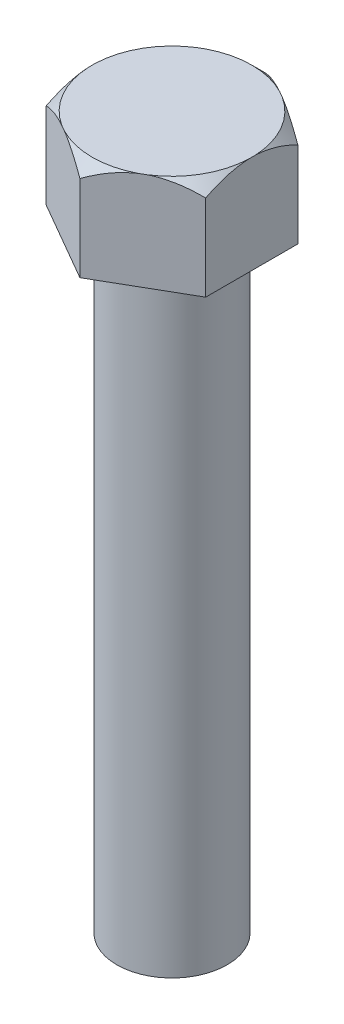
ISO-10303-21;
HEADER;
FILE_DESCRIPTION(('STEP AP214'),'2;1');
FILE_NAME('part.step','',(''),(''),'','','');
FILE_SCHEMA(('AUTOMOTIVE_DESIGN { 1 0 10303 214 1 1 1 1 }'));
ENDSEC;
DATA;
#1=APPLICATION_CONTEXT('core data for automotive mechanical design processes');
#2=APPLICATION_PROTOCOL_DEFINITION('international standard','automotive_design',2000,#1);
#3=PRODUCT_CONTEXT('',#1,'mechanical');
#4=PRODUCT('Part','Part','',(#3));
#5=PRODUCT_RELATED_PRODUCT_CATEGORY('part','',(#4));
#6=PRODUCT_DEFINITION_FORMATION('','',#4);
#7=PRODUCT_DEFINITION_CONTEXT('part definition',#1,'design');
#8=PRODUCT_DEFINITION('design','',#6,#7);
#9=PRODUCT_DEFINITION_SHAPE('','',#8);
#10=(LENGTH_UNIT() NAMED_UNIT(*) SI_UNIT(.MILLI.,.METRE.));
#11=(NAMED_UNIT(*) PLANE_ANGLE_UNIT() SI_UNIT($,.RADIAN.));
#12=(NAMED_UNIT(*) SI_UNIT($,.STERADIAN.) SOLID_ANGLE_UNIT());
#13=UNCERTAINTY_MEASURE_WITH_UNIT(LENGTH_MEASURE(1.E-05),#10,'distance_accuracy_value','');
#14=(GEOMETRIC_REPRESENTATION_CONTEXT(3) GLOBAL_UNCERTAINTY_ASSIGNED_CONTEXT((#13)) GLOBAL_UNIT_ASSIGNED_CONTEXT((#10,
#11,#12)) REPRESENTATION_CONTEXT('',''));
#15=CARTESIAN_POINT('',(0.,0.,0.));
#16=DIRECTION('',(0.,0.,1.));
#17=DIRECTION('',(1.,0.,0.));
#18=AXIS2_PLACEMENT_3D('',#15,#16,#17);
#19=CARTESIAN_POINT('',(0.,29.,0.));
#20=DIRECTION('',(0.,1.,0.));
#21=DIRECTION('',(0.,0.,1.));
#22=AXIS2_PLACEMENT_3D('',#19,#20,#21);
#23=PLANE('',#22);
#24=CARTESIAN_POINT('',(0.,29.,0.));
#25=DIRECTION('',(0.,1.,0.));
#26=DIRECTION('',(0.,0.,1.));
#27=AXIS2_PLACEMENT_3D('',#24,#25,#26);
#28=CIRCLE('',#27,3.25277674973257);
#29=CARTESIAN_POINT('',(-1.74137197987736,29.,2.7473951683911));
#30=VERTEX_POINT('',#29);
#31=CARTESIAN_POINT('',(-3.25,29.,0.13437478781665));
#32=VERTEX_POINT('',#31);
#33=EDGE_CURVE('E11',#30,#32,#28,.F.);
#34=ORIENTED_EDGE('',*,*,#33,.F.);
#35=DIRECTION('',(0.866025403784439,0.,0.5));
#36=VECTOR('',#35,1.);
#37=CARTESIAN_POINT('',(-3.25,29.,1.87638837486628));
#38=LINE('',#37,#36);
#39=CARTESIAN_POINT('',(-1.50862802012264,29.,2.88176995620775));
#40=VERTEX_POINT('',#39);
#41=EDGE_CURVE('E252',#30,#40,#38,.T.);
#42=ORIENTED_EDGE('',*,*,#41,.T.);
#43=CARTESIAN_POINT('',(1.50862802012261,29.,2.88176995620777));
#44=VERTEX_POINT('',#43);
#45=EDGE_CURVE('E45',#44,#40,#28,.F.);
#46=ORIENTED_EDGE('',*,*,#45,.F.);
#47=DIRECTION('',(0.866025403784439,0.,-0.5));
#48=VECTOR('',#47,1.);
#49=CARTESIAN_POINT('',(0.,29.,3.75277674973257));
#50=LINE('',#49,#48);
#51=CARTESIAN_POINT('',(1.74137197987739,29.,2.74739516839108));
#52=VERTEX_POINT('',#51);
#53=EDGE_CURVE('E256',#44,#52,#50,.T.);
#54=ORIENTED_EDGE('',*,*,#53,.T.);
#55=CARTESIAN_POINT('',(3.25,29.,0.13437478781668));
#56=VERTEX_POINT('',#55);
#57=EDGE_CURVE('E288',#56,#52,#28,.F.);
#58=ORIENTED_EDGE('',*,*,#57,.F.);
#59=DIRECTION('',(0.,0.,-1.));
#60=VECTOR('',#59,1.);
#61=CARTESIAN_POINT('',(3.25,29.,1.87638837486628));
#62=LINE('',#61,#60);
#63=CARTESIAN_POINT('',(3.25,29.,-0.134374787816682));
#64=VERTEX_POINT('',#63);
#65=EDGE_CURVE('E259',#56,#64,#62,.T.);
#66=ORIENTED_EDGE('',*,*,#65,.T.);
#67=CARTESIAN_POINT('',(1.74137197987735,29.,-2.74739516839111));
#68=VERTEX_POINT('',#67);
#69=EDGE_CURVE('E287',#68,#64,#28,.F.);
#70=ORIENTED_EDGE('',*,*,#69,.F.);
#71=DIRECTION('',(-0.866025403784439,0.,-0.5));
#72=VECTOR('',#71,1.);
#73=CARTESIAN_POINT('',(3.25,29.,-1.87638837486629));
#74=LINE('',#73,#72);
#75=CARTESIAN_POINT('',(1.50862802012265,29.,-2.88176995620774));
#76=VERTEX_POINT('',#75);
#77=EDGE_CURVE('E262',#68,#76,#74,.T.);
#78=ORIENTED_EDGE('',*,*,#77,.T.);
#79=CARTESIAN_POINT('',(-1.50862802012264,29.,-2.88176995620775));
#80=VERTEX_POINT('',#79);
#81=EDGE_CURVE('E130',#80,#76,#28,.F.);
#82=ORIENTED_EDGE('',*,*,#81,.F.);
#83=DIRECTION('',(-0.866025403784439,0.,0.5));
#84=VECTOR('',#83,1.);
#85=CARTESIAN_POINT('',(0.,29.,-3.75277674973257));
#86=LINE('',#85,#84);
#87=CARTESIAN_POINT('',(-1.74137197987736,29.,-2.7473951683911));
#88=VERTEX_POINT('',#87);
#89=EDGE_CURVE('E146',#80,#88,#86,.T.);
#90=ORIENTED_EDGE('',*,*,#89,.T.);
#91=CARTESIAN_POINT('',(-3.25,29.,-0.13437478781665));
#92=VERTEX_POINT('',#91);
#93=EDGE_CURVE('E50',#92,#88,#28,.F.);
#94=ORIENTED_EDGE('',*,*,#93,.F.);
#95=DIRECTION('',(0.,0.,1.));
#96=VECTOR('',#95,1.);
#97=CARTESIAN_POINT('',(-3.25,29.,-1.87638837486628));
#98=LINE('',#97,#96);
#99=EDGE_CURVE('E249',#92,#32,#98,.T.);
#100=ORIENTED_EDGE('',*,*,#99,.T.);
#101=EDGE_LOOP('',(#34,#42,#46,#54,#58,#66,#70,#78,#82,#90,#94,#100));
#102=FACE_BOUND('',#101,.T.);
#103=ADVANCED_FACE('F41',(#102),#23,.T.);
#104=CARTESIAN_POINT('',(0.,25.,0.));
#105=DIRECTION('',(0.,-1.,0.));
#106=DIRECTION('',(0.,0.,-1.));
#107=AXIS2_PLACEMENT_3D('',#104,#105,#106);
#108=CYLINDRICAL_SURFACE('',#107,2.25);
#109=CARTESIAN_POINT('',(0.,25.,0.));
#110=DIRECTION('',(0.,1.,0.));
#111=DIRECTION('',(0.,0.,1.));
#112=AXIS2_PLACEMENT_3D('',#109,#110,#111);
#113=CIRCLE('',#112,2.25);
#114=CARTESIAN_POINT('',(0.,25.,2.25));
#115=VERTEX_POINT('',#114);
#116=EDGE_CURVE('E166',#115,#115,#113,.T.);
#117=ORIENTED_EDGE('',*,*,#116,.F.);
#118=EDGE_LOOP('',(#117));
#119=FACE_BOUND('',#118,.T.);
#120=CARTESIAN_POINT('',(0.,0.,0.));
#121=DIRECTION('',(0.,1.,0.));
#122=DIRECTION('',(0.,0.,1.));
#123=AXIS2_PLACEMENT_3D('',#120,#121,#122);
#124=CIRCLE('',#123,2.25);
#125=CARTESIAN_POINT('',(0.,0.,2.25));
#126=VERTEX_POINT('',#125);
#127=EDGE_CURVE('E165',#126,#126,#124,.T.);
#128=ORIENTED_EDGE('',*,*,#127,.T.);
#129=EDGE_LOOP('',(#128));
#130=FACE_BOUND('',#129,.T.);
#131=ADVANCED_FACE('F43',(#119,#130),#108,.T.);
#132=CARTESIAN_POINT('',(0.,0.,0.));
#133=DIRECTION('',(0.,1.,0.));
#134=DIRECTION('',(0.,0.,1.));
#135=AXIS2_PLACEMENT_3D('',#132,#133,#134);
#136=PLANE('',#135);
#137=ORIENTED_EDGE('',*,*,#127,.F.);
#138=EDGE_LOOP('',(#137));
#139=FACE_BOUND('',#138,.T.);
#140=ADVANCED_FACE('F172',(#139),#136,.F.);
#141=CARTESIAN_POINT('',(-3.25,29.,-1.87638837486628));
#142=DIRECTION('',(1.,0.,0.));
#143=DIRECTION('',(0.,0.,-1.));
#144=AXIS2_PLACEMENT_3D('',#141,#142,#143);
#145=PLANE('',#144);
#146=DIRECTION('',(0.,-1.,0.));
#147=VECTOR('',#146,1.);
#148=CARTESIAN_POINT('',(-3.25,29.,1.87638837486628));
#149=LINE('',#148,#147);
#150=CARTESIAN_POINT('',(-3.25,28.5,1.87638837486628));
#151=VERTEX_POINT('',#150);
#152=CARTESIAN_POINT('',(-3.25,25.,1.87638837486628));
#153=VERTEX_POINT('',#152);
#154=EDGE_CURVE('E163',#151,#153,#149,.T.);
#155=ORIENTED_EDGE('',*,*,#154,.F.);
#156=CARTESIAN_POINT('',(-3.25,28.4996499510408,1.87708837486628));
#157=CARTESIAN_POINT('',(-3.25,28.5641194144798,1.74806140663062));
#158=CARTESIAN_POINT('',(-3.25,28.6248034943531,1.61687666526746));
#159=CARTESIAN_POINT('',(-3.25,28.7359163947859,1.34937504006712));
#160=CARTESIAN_POINT('',(-3.25,28.7862833613688,1.21303269360306));
#161=CARTESIAN_POINT('',(-3.25,28.8725639711973,0.938104609834275));
#162=CARTESIAN_POINT('',(-3.25,28.9086945681573,0.799588949298756));
#163=CARTESIAN_POINT('',(-3.25,28.9643621668849,0.519506890536666));
#164=CARTESIAN_POINT('',(-3.25,28.9839407479541,0.377949058173771));
#165=CARTESIAN_POINT('',(-3.25,29.0016050965552,0.134002756973398));
#166=CARTESIAN_POINT('',(-3.25,29.0042212127357,0.03192968347279));
#167=CARTESIAN_POINT('',(-3.25,28.9998221619706,-0.172050683222062));
#168=CARTESIAN_POINT('',(-3.25,28.9928036175523,-0.273957905736443));
#169=CARTESIAN_POINT('',(-3.25,28.9695359808998,-0.476807166926643));
#170=CARTESIAN_POINT('',(-3.25,28.953276555016,-0.577747996214983));
#171=CARTESIAN_POINT('',(-3.25,28.9124146721438,-0.777896129107223));
#172=CARTESIAN_POINT('',(-3.25,28.8878128543911,-0.877103564920141));
#173=CARTESIAN_POINT('',(-3.25,28.8371817826015,-1.05327116771118));
#174=CARTESIAN_POINT('',(-3.25,28.8124805751395,-1.13062038138379));
#175=CARTESIAN_POINT('',(-3.25,28.7590949603885,-1.28392934985116));
#176=CARTESIAN_POINT('',(-3.25,28.73041042897,-1.35988906126236));
#177=CARTESIAN_POINT('',(-3.25,28.6697018275138,-1.51017979923945));
#178=CARTESIAN_POINT('',(-3.25,28.6376882543583,-1.58451510140433));
#179=CARTESIAN_POINT('',(-3.25,28.5707425266135,-1.731808162804));
#180=CARTESIAN_POINT('',(-3.25,28.53581216787,-1.80476673624554));
#181=CARTESIAN_POINT('',(-3.25,28.4996499510408,-1.87708837486628));
#182=B_SPLINE_CURVE_WITH_KNOTS('',3,(#156,#157,#158,#159,#160,#161,#162,#163,#164,#165,#166,
#167,#168,#169,#170,#171,#172,#173,#174,#175,#176,#177,#178,#179,#180,#181),.UNSPECIFIED.,.F.,
.F.,(4,2,2,2,2,2,2,2,2,2,2,2,4),(0.,0.433010464698972,0.868545507974873,1.2971596395815,
1.72469384938688,2.03058059883779,2.3365746056212,2.64291146648745,2.9492248595918,
3.19270329602768,3.43618932150923,3.67892963531958,3.92152158217097),.UNSPECIFIED.);
#183=EDGE_CURVE('E219',#151,#32,#182,.T.);
#184=ORIENTED_EDGE('',*,*,#183,.T.);
#185=ORIENTED_EDGE('',*,*,#99,.F.);
#186=CARTESIAN_POINT('',(-3.25,28.5,-1.87638837486628));
#187=VERTEX_POINT('',#186);
#188=EDGE_CURVE('E212',#92,#187,#182,.T.);
#189=ORIENTED_EDGE('',*,*,#188,.T.);
#190=DIRECTION('',(0.,-1.,0.));
#191=VECTOR('',#190,1.);
#192=CARTESIAN_POINT('',(-3.25,29.,-1.87638837486628));
#193=LINE('',#192,#191);
#194=CARTESIAN_POINT('',(-3.25,25.,-1.87638837486628));
#195=VERTEX_POINT('',#194);
#196=EDGE_CURVE('E153',#187,#195,#193,.T.);
#197=ORIENTED_EDGE('',*,*,#196,.T.);
#198=DIRECTION('',(0.,0.,1.));
#199=VECTOR('',#198,1.);
#200=CARTESIAN_POINT('',(-3.25,25.,-1.87638837486628));
#201=LINE('',#200,#199);
#202=EDGE_CURVE('E265',#195,#153,#201,.T.);
#203=ORIENTED_EDGE('',*,*,#202,.T.);
#204=EDGE_LOOP('',(#155,#184,#185,#189,#197,#203));
#205=FACE_BOUND('',#204,.T.);
#206=ADVANCED_FACE('F174',(#205),#145,.F.);
#207=CARTESIAN_POINT('',(-3.25,29.,1.87638837486628));
#208=DIRECTION('',(0.5,0.,-0.866025403784439));
#209=DIRECTION('',(-0.866025403784439,0.,-0.5));
#210=AXIS2_PLACEMENT_3D('',#207,#208,#209);
#211=PLANE('',#210);
#212=DIRECTION('',(0.,-1.,0.));
#213=VECTOR('',#212,1.);
#214=CARTESIAN_POINT('',(0.,29.,3.75277674973257));
#215=LINE('',#214,#213);
#216=CARTESIAN_POINT('',(0.,28.5,3.75277674973257));
#217=VERTEX_POINT('',#216);
#218=CARTESIAN_POINT('',(0.,25.,3.75277674973257));
#219=VERTEX_POINT('',#218);
#220=EDGE_CURVE('E161',#217,#219,#215,.T.);
#221=ORIENTED_EDGE('',*,*,#220,.F.);
#222=CARTESIAN_POINT('',(0.00069999999999869,28.4995957895336,3.753180894921));
#223=CARTESIAN_POINT('',(-0.111046289110585,28.5640712831549,3.68866414482206));
#224=CARTESIAN_POINT('',(-0.224661416340914,28.6247612936672,3.62306842053162));
#225=CARTESIAN_POINT('',(-0.456336795510824,28.7358855078706,3.48931057800326));
#226=CARTESIAN_POINT('',(-0.574419104867048,28.7862578433917,3.42113572490991));
#227=CARTESIAN_POINT('',(-0.812526722788286,28.8725479049676,3.28366422760699));
#228=CARTESIAN_POINT('',(-0.932491326522309,28.9086826316315,3.21440263134792));
#229=CARTESIAN_POINT('',(-1.17506297029779,28.9643568340658,3.07435382751638));
#230=CARTESIAN_POINT('',(-1.29766258957158,28.9839379004237,3.00357090432611));
#231=CARTESIAN_POINT('',(-1.50893357896319,29.0016043142219,2.8815935417289));
#232=CARTESIAN_POINT('',(-1.59733172548032,29.0042210386932,2.83055684804137));
#233=CARTESIAN_POINT('',(-1.77398449926987,28.9998231352672,2.72856632154089));
#234=CARTESIAN_POINT('',(-1.86223906534411,28.9928051296215,2.67761252406071));
#235=CARTESIAN_POINT('',(-2.03791237642233,28.9695384677358,2.57618749062027));
#236=CARTESIAN_POINT('',(-2.12533007389141,28.9532794756515,2.52571685945456));
#237=CARTESIAN_POINT('',(-2.29866420436754,28.9124183460767,2.42564235256441));
#238=CARTESIAN_POINT('',(-2.38458075185332,28.8878168477374,2.37603841074565));
#239=CARTESIAN_POINT('',(-2.53715630565944,28.8371831846895,2.28794887368393));
#240=CARTESIAN_POINT('',(-2.60415207767239,28.8124784639045,2.24926884667769));
#241=CARTESIAN_POINT('',(-2.73693998182797,28.7590847460641,2.17260371446834));
#242=CARTESIAN_POINT('',(-2.80273207619929,28.7303956242204,2.13461863107251));
#243=CARTESIAN_POINT('',(-2.93290543735243,28.6696770007024,2.05946300596942));
#244=CARTESIAN_POINT('',(-2.99729040761077,28.6376579975776,2.02229032605901));
#245=CARTESIAN_POINT('',(-3.12486702753078,28.5707007610544,1.94863393020589));
#246=CARTESIAN_POINT('',(-3.18805938293488,28.5357643250104,1.9121498068026));
#247=CARTESIAN_POINT('',(-3.2507,28.4995957895336,1.87598422967785));
#248=B_SPLINE_CURVE_WITH_KNOTS('',3,(#222,#223,#224,#225,#226,#227,#228,#229,#230,#231,#232,
#233,#234,#235,#236,#237,#238,#239,#240,#241,#242,#243,#244,#245,#246,#247),.UNSPECIFIED.,.F.,
.F.,(4,2,2,2,2,2,2,2,2,2,2,2,4),(0.,0.433036137444976,0.868597429704401,1.29723645069767,
1.72479530070442,2.03068303837047,2.33667804170128,2.64301596927159,2.94933043242985,
3.19284300140639,3.43636319873103,3.67913764567816,3.9217636137246),.UNSPECIFIED.);
#249=EDGE_CURVE('E235',#217,#40,#248,.T.);
#250=ORIENTED_EDGE('',*,*,#249,.T.);
#251=ORIENTED_EDGE('',*,*,#41,.F.);
#252=EDGE_CURVE('E242',#30,#151,#248,.T.);
#253=ORIENTED_EDGE('',*,*,#252,.T.);
#254=ORIENTED_EDGE('',*,*,#154,.T.);
#255=DIRECTION('',(0.866025403784439,0.,0.5));
#256=VECTOR('',#255,1.);
#257=CARTESIAN_POINT('',(-3.25,25.,1.87638837486628));
#258=LINE('',#257,#256);
#259=EDGE_CURVE('E268',#153,#219,#258,.T.);
#260=ORIENTED_EDGE('',*,*,#259,.T.);
#261=EDGE_LOOP('',(#221,#250,#251,#253,#254,#260));
#262=FACE_BOUND('',#261,.T.);
#263=ADVANCED_FACE('F180',(#262),#211,.F.);
#264=CARTESIAN_POINT('',(0.,29.,3.75277674973257));
#265=DIRECTION('',(-0.5,0.,-0.866025403784439));
#266=DIRECTION('',(-0.866025403784439,0.,0.5));
#267=AXIS2_PLACEMENT_3D('',#264,#265,#266);
#268=PLANE('',#267);
#269=DIRECTION('',(0.,-1.,0.));
#270=VECTOR('',#269,1.);
#271=CARTESIAN_POINT('',(3.25,29.,1.87638837486628));
#272=LINE('',#271,#270);
#273=CARTESIAN_POINT('',(3.25,28.5,1.87638837486629));
#274=VERTEX_POINT('',#273);
#275=CARTESIAN_POINT('',(3.25,25.,1.87638837486628));
#276=VERTEX_POINT('',#275);
#277=EDGE_CURVE('E155',#274,#276,#272,.T.);
#278=ORIENTED_EDGE('',*,*,#277,.F.);
#279=CARTESIAN_POINT('',(3.2507,28.4995957895336,1.87598422967785));
#280=CARTESIAN_POINT('',(3.13895371088942,28.5640712831549,1.94050097977679));
#281=CARTESIAN_POINT('',(3.02533858365909,28.6247612936672,2.00609670406723));
#282=CARTESIAN_POINT('',(2.79366320448918,28.7358855078706,2.13985454659559));
#283=CARTESIAN_POINT('',(2.67558089513295,28.7862578433917,2.20802939968894));
#284=CARTESIAN_POINT('',(2.43747327721171,28.8725479049676,2.34550089699186));
#285=CARTESIAN_POINT('',(2.31750867347769,28.9086826316315,2.41476249325093));
#286=CARTESIAN_POINT('',(2.07493702970221,28.9643568340658,2.55481129708247));
#287=CARTESIAN_POINT('',(1.95233741042842,28.9839379004237,2.62559422027274));
#288=CARTESIAN_POINT('',(1.74106642103681,29.0016043142219,2.74757158286995));
#289=CARTESIAN_POINT('',(1.65266827451968,29.0042210386932,2.79860827655748));
#290=CARTESIAN_POINT('',(1.47601550073013,28.9998231352673,2.90059880305797));
#291=CARTESIAN_POINT('',(1.38776093465589,28.9928051296215,2.95155260053814));
#292=CARTESIAN_POINT('',(1.21208762357767,28.9695384677358,3.05297763397859));
#293=CARTESIAN_POINT('',(1.12466992610859,28.9532794756515,3.10344826514429));
#294=CARTESIAN_POINT('',(0.951335795632455,28.9124183460767,3.20352277203444));
#295=CARTESIAN_POINT('',(0.865419248146681,28.8878168477374,3.2531267138532));
#296=CARTESIAN_POINT('',(0.712843694340558,28.8371831846895,3.34121625091492));
#297=CARTESIAN_POINT('',(0.645847922327614,28.8124784639045,3.37989627792116));
#298=CARTESIAN_POINT('',(0.513060018172026,28.7590847460641,3.45656141013051));
#299=CARTESIAN_POINT('',(0.447267923800713,28.7303956242204,3.49454649352634));
#300=CARTESIAN_POINT('',(0.317094562647568,28.6696770007024,3.56970211862943));
#301=CARTESIAN_POINT('',(0.25270959238923,28.6376579975776,3.60687479853984));
#302=CARTESIAN_POINT('',(0.125132972469219,28.5707007610544,3.68053119439296));
#303=CARTESIAN_POINT('',(0.0619406170651184,28.5357643250104,3.71701531779625));
#304=CARTESIAN_POINT('',(-0.000700000000001492,28.4995957895336,3.753180894921));
#305=B_SPLINE_CURVE_WITH_KNOTS('',3,(#279,#280,#281,#282,#283,#284,#285,#286,#287,#288,#289,
#290,#291,#292,#293,#294,#295,#296,#297,#298,#299,#300,#301,#302,#303,#304),.UNSPECIFIED.,.F.,
.F.,(4,2,2,2,2,2,2,2,2,2,2,2,4),(0.,0.433036137444976,0.868597429704401,1.29723645069768,
1.72479530070442,2.03068303837048,2.33667804170129,2.6430159692716,2.94933043242986,
3.1928430014064,3.43636319873104,3.67913764567817,3.92176361372461),.UNSPECIFIED.);
#306=EDGE_CURVE('E244',#274,#52,#305,.T.);
#307=ORIENTED_EDGE('',*,*,#306,.T.);
#308=ORIENTED_EDGE('',*,*,#53,.F.);
#309=EDGE_CURVE('E243',#44,#217,#305,.T.);
#310=ORIENTED_EDGE('',*,*,#309,.T.);
#311=ORIENTED_EDGE('',*,*,#220,.T.);
#312=DIRECTION('',(0.866025403784439,0.,-0.5));
#313=VECTOR('',#312,1.);
#314=CARTESIAN_POINT('',(0.,25.,3.75277674973257));
#315=LINE('',#314,#313);
#316=EDGE_CURVE('E271',#219,#276,#315,.T.);
#317=ORIENTED_EDGE('',*,*,#316,.T.);
#318=EDGE_LOOP('',(#278,#307,#308,#310,#311,#317));
#319=FACE_BOUND('',#318,.T.);
#320=ADVANCED_FACE('F231',(#319),#268,.F.);
#321=CARTESIAN_POINT('',(3.25,29.,1.87638837486628));
#322=DIRECTION('',(-1.,0.,0.));
#323=DIRECTION('',(0.,0.,1.));
#324=AXIS2_PLACEMENT_3D('',#321,#322,#323);
#325=PLANE('',#324);
#326=DIRECTION('',(0.,-1.,0.));
#327=VECTOR('',#326,1.);
#328=CARTESIAN_POINT('',(3.25,29.,-1.87638837486629));
#329=LINE('',#328,#327);
#330=CARTESIAN_POINT('',(3.25,28.5,-1.87638837486629));
#331=VERTEX_POINT('',#330);
#332=CARTESIAN_POINT('',(3.25,25.,-1.87638837486629));
#333=VERTEX_POINT('',#332);
#334=EDGE_CURVE('E152',#331,#333,#329,.T.);
#335=ORIENTED_EDGE('',*,*,#334,.F.);
#336=CARTESIAN_POINT('',(3.25,28.4996499510408,-1.87708837486629));
#337=CARTESIAN_POINT('',(3.25,28.5641194144798,-1.74806140663063));
#338=CARTESIAN_POINT('',(3.25,28.6248034943531,-1.61687666526746));
#339=CARTESIAN_POINT('',(3.25,28.7359163947859,-1.34937504006712));
#340=CARTESIAN_POINT('',(3.25,28.7862833613688,-1.21303269360306));
#341=CARTESIAN_POINT('',(3.25,28.8725639711973,-0.938104609834278));
#342=CARTESIAN_POINT('',(3.25,28.9086945681573,-0.799588949298758));
#343=CARTESIAN_POINT('',(3.25,28.9643621668849,-0.519506890536668));
#344=CARTESIAN_POINT('',(3.25,28.9839407479541,-0.377949058173773));
#345=CARTESIAN_POINT('',(3.25,29.0016050965552,-0.1340027569734));
#346=CARTESIAN_POINT('',(3.25,29.0042212127357,-0.0319296834727918));
#347=CARTESIAN_POINT('',(3.25,28.9998221619706,0.17205068322206));
#348=CARTESIAN_POINT('',(3.25,28.9928036175523,0.273957905736441));
#349=CARTESIAN_POINT('',(3.25,28.9695359808998,0.476807166926641));
#350=CARTESIAN_POINT('',(3.25,28.953276555016,0.577747996214981));
#351=CARTESIAN_POINT('',(3.25,28.9124146721438,0.777896129107221));
#352=CARTESIAN_POINT('',(3.25,28.8878128543911,0.877103564920139));
#353=CARTESIAN_POINT('',(3.25,28.8371817826015,1.05327116771118));
#354=CARTESIAN_POINT('',(3.25,28.8124805751395,1.13062038138378));
#355=CARTESIAN_POINT('',(3.25,28.7590949603885,1.28392934985116));
#356=CARTESIAN_POINT('',(3.25,28.73041042897,1.35988906126236));
#357=CARTESIAN_POINT('',(3.25,28.6697018275138,1.51017979923945));
#358=CARTESIAN_POINT('',(3.25,28.6376882543583,1.58451510140433));
#359=CARTESIAN_POINT('',(3.25,28.5707425266135,1.73180816280399));
#360=CARTESIAN_POINT('',(3.25,28.53581216787,1.80476673624554));
#361=CARTESIAN_POINT('',(3.25,28.4996499510408,1.87708837486628));
#362=B_SPLINE_CURVE_WITH_KNOTS('',3,(#336,#337,#338,#339,#340,#341,#342,#343,#344,#345,#346,
#347,#348,#349,#350,#351,#352,#353,#354,#355,#356,#357,#358,#359,#360,#361),.UNSPECIFIED.,.F.,
.F.,(4,2,2,2,2,2,2,2,2,2,2,2,4),(0.,0.433010464698974,0.868545507974873,1.2971596395815,
1.72469384938688,2.03058059883779,2.3365746056212,2.64291146648745,2.9492248595918,
3.19270329602768,3.43618932150923,3.67892963531958,3.92152158217097),.UNSPECIFIED.);
#363=EDGE_CURVE('E220',#331,#64,#362,.T.);
#364=ORIENTED_EDGE('',*,*,#363,.T.);
#365=ORIENTED_EDGE('',*,*,#65,.F.);
#366=EDGE_CURVE('E304',#56,#274,#362,.T.);
#367=ORIENTED_EDGE('',*,*,#366,.T.);
#368=ORIENTED_EDGE('',*,*,#277,.T.);
#369=DIRECTION('',(0.,0.,-1.));
#370=VECTOR('',#369,1.);
#371=CARTESIAN_POINT('',(3.25,25.,1.87638837486628));
#372=LINE('',#371,#370);
#373=EDGE_CURVE('E274',#276,#333,#372,.T.);
#374=ORIENTED_EDGE('',*,*,#373,.T.);
#375=EDGE_LOOP('',(#335,#364,#365,#367,#368,#374));
#376=FACE_BOUND('',#375,.T.);
#377=ADVANCED_FACE('F309',(#376),#325,.F.);
#378=CARTESIAN_POINT('',(3.25,29.,-1.87638837486629));
#379=DIRECTION('',(-0.5,0.,0.866025403784439));
#380=DIRECTION('',(0.866025403784439,0.,0.5));
#381=AXIS2_PLACEMENT_3D('',#378,#379,#380);
#382=PLANE('',#381);
#383=DIRECTION('',(0.,-1.,0.));
#384=VECTOR('',#383,1.);
#385=CARTESIAN_POINT('',(0.,29.,-3.75277674973257));
#386=LINE('',#385,#384);
#387=CARTESIAN_POINT('',(0.,28.5,-3.75277674973257));
#388=VERTEX_POINT('',#387);
#389=CARTESIAN_POINT('',(0.,25.,-3.75277674973257));
#390=VERTEX_POINT('',#389);
#391=EDGE_CURVE('E142',#388,#390,#386,.T.);
#392=ORIENTED_EDGE('',*,*,#391,.F.);
#393=CARTESIAN_POINT('',(-0.000699999999999953,28.4995957895336,-3.753180894921));
#394=CARTESIAN_POINT('',(0.111046289110583,28.5640712831549,-3.68866414482206));
#395=CARTESIAN_POINT('',(0.224661416340912,28.6247612936672,-3.62306842053162));
#396=CARTESIAN_POINT('',(0.456336795510821,28.7358855078706,-3.48931057800326));
#397=CARTESIAN_POINT('',(0.574419104867045,28.7862578433917,-3.42113572490992));
#398=CARTESIAN_POINT('',(0.812526722788283,28.8725479049676,-3.28366422760699));
#399=CARTESIAN_POINT('',(0.932491326522307,28.9086826316315,-3.21440263134792));
#400=CARTESIAN_POINT('',(1.17506297029779,28.9643568340658,-3.07435382751638));
#401=CARTESIAN_POINT('',(1.29766258957158,28.9839379004237,-3.00357090432611));
#402=CARTESIAN_POINT('',(1.50893357896319,29.0016043142219,-2.88159354172891));
#403=CARTESIAN_POINT('',(1.59733172548032,29.0042210386932,-2.83055684804138));
#404=CARTESIAN_POINT('',(1.77398449926987,28.9998231352672,-2.72856632154089));
#405=CARTESIAN_POINT('',(1.86223906534411,28.9928051296215,-2.67761252406071));
#406=CARTESIAN_POINT('',(2.03791237642233,28.9695384677358,-2.57618749062027));
#407=CARTESIAN_POINT('',(2.12533007389141,28.9532794756515,-2.52571685945456));
#408=CARTESIAN_POINT('',(2.29866420436754,28.9124183460767,-2.42564235256441));
#409=CARTESIAN_POINT('',(2.38458075185332,28.8878168477374,-2.37603841074566));
#410=CARTESIAN_POINT('',(2.53715630565944,28.8371831846895,-2.28794887368393));
#411=CARTESIAN_POINT('',(2.60415207767238,28.8124784639045,-2.24926884667769));
#412=CARTESIAN_POINT('',(2.73693998182797,28.7590847460641,-2.17260371446834));
#413=CARTESIAN_POINT('',(2.80273207619929,28.7303956242204,-2.13461863107251));
#414=CARTESIAN_POINT('',(2.93290543735243,28.6696770007024,-2.05946300596943));
#415=CARTESIAN_POINT('',(2.99729040761077,28.6376579975776,-2.02229032605901));
#416=CARTESIAN_POINT('',(3.12486702753078,28.5707007610544,-1.94863393020589));
#417=CARTESIAN_POINT('',(3.18805938293488,28.5357643250104,-1.9121498068026));
#418=CARTESIAN_POINT('',(3.2507,28.4995957895336,-1.87598422967785));
#419=B_SPLINE_CURVE_WITH_KNOTS('',3,(#393,#394,#395,#396,#397,#398,#399,#400,#401,#402,#403,
#404,#405,#406,#407,#408,#409,#410,#411,#412,#413,#414,#415,#416,#417,#418),.UNSPECIFIED.,.F.,
.F.,(4,2,2,2,2,2,2,2,2,2,2,2,4),(0.,0.433036137444975,0.868597429704399,1.29723645069767,
1.72479530070441,2.03068303837047,2.33667804170128,2.64301596927159,2.94933043242985,
3.19284300140639,3.43636319873103,3.67913764567816,3.9217636137246),.UNSPECIFIED.);
#420=EDGE_CURVE('E128',#388,#76,#419,.T.);
#421=ORIENTED_EDGE('',*,*,#420,.T.);
#422=ORIENTED_EDGE('',*,*,#77,.F.);
#423=EDGE_CURVE('E65',#68,#331,#419,.T.);
#424=ORIENTED_EDGE('',*,*,#423,.T.);
#425=ORIENTED_EDGE('',*,*,#334,.T.);
#426=DIRECTION('',(-0.866025403784439,0.,-0.5));
#427=VECTOR('',#426,1.);
#428=CARTESIAN_POINT('',(3.25,25.,-1.87638837486629));
#429=LINE('',#428,#427);
#430=EDGE_CURVE('E150',#333,#390,#429,.T.);
#431=ORIENTED_EDGE('',*,*,#430,.T.);
#432=EDGE_LOOP('',(#392,#421,#422,#424,#425,#431));
#433=FACE_BOUND('',#432,.T.);
#434=ADVANCED_FACE('F148',(#433),#382,.F.);
#435=CARTESIAN_POINT('',(0.,29.,-3.75277674973257));
#436=DIRECTION('',(0.5,0.,0.866025403784439));
#437=DIRECTION('',(0.866025403784439,0.,-0.5));
#438=AXIS2_PLACEMENT_3D('',#435,#436,#437);
#439=PLANE('',#438);
#440=ORIENTED_EDGE('',*,*,#196,.F.);
#441=CARTESIAN_POINT('',(-3.2507,28.4995957895336,-1.87598422967785));
#442=CARTESIAN_POINT('',(-3.13895371088942,28.5640712831549,-1.94050097977679));
#443=CARTESIAN_POINT('',(-3.02533858365909,28.6247612936672,-2.00609670406723));
#444=CARTESIAN_POINT('',(-2.79366320448918,28.7358855078706,-2.13985454659559));
#445=CARTESIAN_POINT('',(-2.67558089513295,28.7862578433917,-2.20802939968894));
#446=CARTESIAN_POINT('',(-2.43747327721172,28.8725479049676,-2.34550089699186));
#447=CARTESIAN_POINT('',(-2.31750867347769,28.9086826316315,-2.41476249325093));
#448=CARTESIAN_POINT('',(-2.07493702970221,28.9643568340658,-2.55481129708247));
#449=CARTESIAN_POINT('',(-1.95233741042842,28.9839379004237,-2.62559422027274));
#450=CARTESIAN_POINT('',(-1.74106642103681,29.0016043142219,-2.74757158286995));
#451=CARTESIAN_POINT('',(-1.65266827451968,29.0042210386932,-2.79860827655748));
#452=CARTESIAN_POINT('',(-1.47601550073013,28.9998231352672,-2.90059880305797));
#453=CARTESIAN_POINT('',(-1.38776093465589,28.9928051296215,-2.95155260053814));
#454=CARTESIAN_POINT('',(-1.21208762357767,28.9695384677358,-3.05297763397859));
#455=CARTESIAN_POINT('',(-1.12466992610859,28.9532794756515,-3.1034482651443));
#456=CARTESIAN_POINT('',(-0.951335795632457,28.9124183460767,-3.20352277203444));
#457=CARTESIAN_POINT('',(-0.865419248146683,28.8878168477374,-3.2531267138532));
#458=CARTESIAN_POINT('',(-0.71284369434056,28.8371831846895,-3.34121625091492));
#459=CARTESIAN_POINT('',(-0.645847922327616,28.8124784639045,-3.37989627792116));
#460=CARTESIAN_POINT('',(-0.513060018172029,28.7590847460641,-3.45656141013051));
#461=CARTESIAN_POINT('',(-0.447267923800715,28.7303956242204,-3.49454649352634));
#462=CARTESIAN_POINT('',(-0.31709456264757,28.6696770007024,-3.56970211862943));
#463=CARTESIAN_POINT('',(-0.252709592389232,28.6376579975776,-3.60687479853984));
#464=CARTESIAN_POINT('',(-0.125132972469221,28.5707007610544,-3.68053119439297));
#465=CARTESIAN_POINT('',(-0.0619406170651202,28.5357643250104,-3.71701531779625));
#466=CARTESIAN_POINT('',(0.000699999999999953,28.4995957895336,-3.753180894921));
#467=B_SPLINE_CURVE_WITH_KNOTS('',3,(#441,#442,#443,#444,#445,#446,#447,#448,#449,#450,#451,
#452,#453,#454,#455,#456,#457,#458,#459,#460,#461,#462,#463,#464,#465,#466),.UNSPECIFIED.,.F.,
.F.,(4,2,2,2,2,2,2,2,2,2,2,2,4),(0.,0.433036137444975,0.8685974297044,1.29723645069767,
1.72479530070441,2.03068303837047,2.33667804170129,2.64301596927159,2.94933043242986,
3.19284300140639,3.43636319873103,3.67913764567817,3.9217636137246),.UNSPECIFIED.);
#468=EDGE_CURVE('E135',#187,#88,#467,.T.);
#469=ORIENTED_EDGE('',*,*,#468,.T.);
#470=ORIENTED_EDGE('',*,*,#89,.F.);
#471=EDGE_CURVE('E57',#80,#388,#467,.T.);
#472=ORIENTED_EDGE('',*,*,#471,.T.);
#473=ORIENTED_EDGE('',*,*,#391,.T.);
#474=DIRECTION('',(-0.866025403784439,0.,0.5));
#475=VECTOR('',#474,1.);
#476=CARTESIAN_POINT('',(0.,25.,-3.75277674973257));
#477=LINE('',#476,#475);
#478=EDGE_CURVE('E253',#390,#195,#477,.T.);
#479=ORIENTED_EDGE('',*,*,#478,.T.);
#480=EDGE_LOOP('',(#440,#469,#470,#472,#473,#479));
#481=FACE_BOUND('',#480,.T.);
#482=ADVANCED_FACE('F140',(#481),#439,.F.);
#483=CARTESIAN_POINT('',(0.,25.,0.));
#484=DIRECTION('',(0.,1.,0.));
#485=DIRECTION('',(0.,0.,1.));
#486=AXIS2_PLACEMENT_3D('',#483,#484,#485);
#487=PLANE('',#486);
#488=ORIENTED_EDGE('',*,*,#116,.T.);
#489=EDGE_LOOP('',(#488));
#490=FACE_BOUND('',#489,.T.);
#491=ORIENTED_EDGE('',*,*,#202,.F.);
#492=ORIENTED_EDGE('',*,*,#478,.F.);
#493=ORIENTED_EDGE('',*,*,#430,.F.);
#494=ORIENTED_EDGE('',*,*,#373,.F.);
#495=ORIENTED_EDGE('',*,*,#316,.F.);
#496=ORIENTED_EDGE('',*,*,#259,.F.);
#497=EDGE_LOOP('',(#491,#492,#493,#494,#495,#496));
#498=FACE_BOUND('',#497,.T.);
#499=ADVANCED_FACE('F194',(#490,#498),#487,.F.);
#500=CARTESIAN_POINT('',(0.,29.,0.));
#501=DIRECTION('',(0.,-1.,0.));
#502=DIRECTION('',(0.,0.,-1.));
#503=AXIS2_PLACEMENT_3D('',#500,#501,#502);
#504=CONICAL_SURFACE('',#503,3.25277674973257,0.785398163397448);
#505=ORIENTED_EDGE('',*,*,#309,.F.);
#506=ORIENTED_EDGE('',*,*,#45,.T.);
#507=ORIENTED_EDGE('',*,*,#249,.F.);
#508=EDGE_LOOP('',(#505,#506,#507));
#509=FACE_BOUND('',#508,.T.);
#510=ADVANCED_FACE('F196',(#509),#504,.T.);
#511=ORIENTED_EDGE('',*,*,#366,.F.);
#512=ORIENTED_EDGE('',*,*,#57,.T.);
#513=ORIENTED_EDGE('',*,*,#306,.F.);
#514=EDGE_LOOP('',(#511,#512,#513));
#515=FACE_BOUND('',#514,.T.);
#516=ADVANCED_FACE('F372',(#515),#504,.T.);
#517=ORIENTED_EDGE('',*,*,#423,.F.);
#518=ORIENTED_EDGE('',*,*,#69,.T.);
#519=ORIENTED_EDGE('',*,*,#363,.F.);
#520=EDGE_LOOP('',(#517,#518,#519));
#521=FACE_BOUND('',#520,.T.);
#522=ADVANCED_FACE('F379',(#521),#504,.T.);
#523=ORIENTED_EDGE('',*,*,#471,.F.);
#524=ORIENTED_EDGE('',*,*,#81,.T.);
#525=ORIENTED_EDGE('',*,*,#420,.F.);
#526=EDGE_LOOP('',(#523,#524,#525));
#527=FACE_BOUND('',#526,.T.);
#528=ADVANCED_FACE('F129',(#527),#504,.T.);
#529=ORIENTED_EDGE('',*,*,#93,.T.);
#530=ORIENTED_EDGE('',*,*,#468,.F.);
#531=ORIENTED_EDGE('',*,*,#188,.F.);
#532=EDGE_LOOP('',(#529,#530,#531));
#533=FACE_BOUND('',#532,.T.);
#534=ADVANCED_FACE('F286',(#533),#504,.T.);
#535=ORIENTED_EDGE('',*,*,#252,.F.);
#536=ORIENTED_EDGE('',*,*,#33,.T.);
#537=ORIENTED_EDGE('',*,*,#183,.F.);
#538=EDGE_LOOP('',(#535,#536,#537));
#539=FACE_BOUND('',#538,.T.);
#540=ADVANCED_FACE('F192',(#539),#504,.T.);
#541=CLOSED_SHELL('',(#103,#131,#140,#206,#263,#320,#377,#434,#482,#499,#510,#516,#522,#528,
#534,#540));
#542=MANIFOLD_SOLID_BREP('B2',#541);
#543=ADVANCED_BREP_SHAPE_REPRESENTATION('',(#18,#542),#14);
#544=SHAPE_DEFINITION_REPRESENTATION(#9,#543);
ENDSEC;
END-ISO-10303-21;
